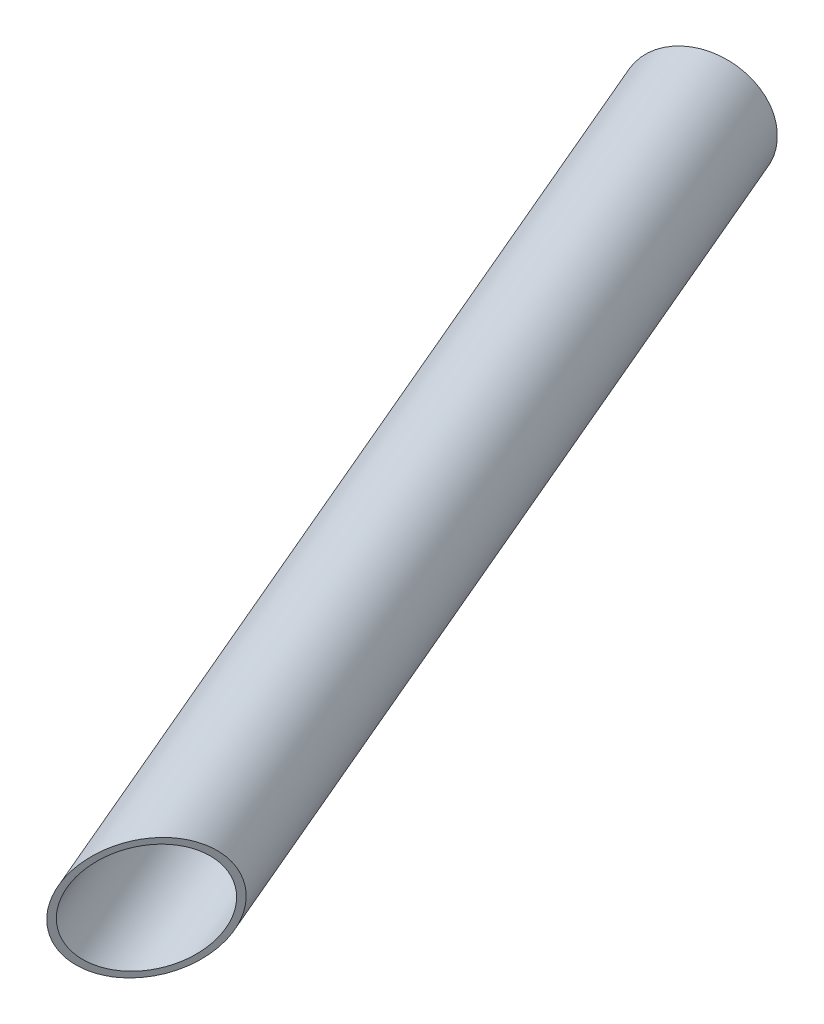
ISO-10303-21;
HEADER;
FILE_DESCRIPTION(('STEP AP214'),'2;1');
FILE_NAME('part.step','',(''),(''),'','','');
FILE_SCHEMA(('AUTOMOTIVE_DESIGN { 1 0 10303 214 1 1 1 1 }'));
ENDSEC;
DATA;
#1=APPLICATION_CONTEXT('core data for automotive mechanical design processes');
#2=APPLICATION_PROTOCOL_DEFINITION('international standard','automotive_design',2000,#1);
#3=PRODUCT_CONTEXT('',#1,'mechanical');
#4=PRODUCT('Part','Part','',(#3));
#5=PRODUCT_RELATED_PRODUCT_CATEGORY('part','',(#4));
#6=PRODUCT_DEFINITION_FORMATION('','',#4);
#7=PRODUCT_DEFINITION_CONTEXT('part definition',#1,'design');
#8=PRODUCT_DEFINITION('design','',#6,#7);
#9=PRODUCT_DEFINITION_SHAPE('','',#8);
#10=(LENGTH_UNIT() NAMED_UNIT(*) SI_UNIT(.MILLI.,.METRE.));
#11=(NAMED_UNIT(*) PLANE_ANGLE_UNIT() SI_UNIT($,.RADIAN.));
#12=(NAMED_UNIT(*) SI_UNIT($,.STERADIAN.) SOLID_ANGLE_UNIT());
#13=UNCERTAINTY_MEASURE_WITH_UNIT(LENGTH_MEASURE(1.E-05),#10,'distance_accuracy_value','');
#14=(GEOMETRIC_REPRESENTATION_CONTEXT(3) GLOBAL_UNCERTAINTY_ASSIGNED_CONTEXT((#13)) GLOBAL_UNIT_ASSIGNED_CONTEXT((#10,
#11,#12)) REPRESENTATION_CONTEXT('',''));
#15=CARTESIAN_POINT('',(0.,0.,0.));
#16=DIRECTION('',(0.,0.,1.));
#17=DIRECTION('',(1.,0.,0.));
#18=AXIS2_PLACEMENT_3D('',#15,#16,#17);
#19=CARTESIAN_POINT('',(-150.,0.,-200.));
#20=DIRECTION('',(0.391140640344852,0.,0.920330918458474));
#21=DIRECTION('',(0.920330918458475,0.,-0.391140640344852));
#22=AXIS2_PLACEMENT_3D('',#19,#20,#21);
#23=CYLINDRICAL_SURFACE('',#22,11.3);
#24=CARTESIAN_POINT('',(-150.,0.,-200.));
#25=DIRECTION('',(-0.391140640344852,0.,-0.920330918458475));
#26=DIRECTION('',(-0.920330918458475,0.,0.391140640344852));
#27=AXIS2_PLACEMENT_3D('',#24,#25,#26);
#28=CIRCLE('',#27,11.3);
#29=CARTESIAN_POINT('',(-160.399739378581,0.,-195.580110764103));
#30=VERTEX_POINT('',#29);
#31=EDGE_CURVE('E53',#30,#30,#28,.T.);
#32=ORIENTED_EDGE('',*,*,#31,.T.);
#33=EDGE_LOOP('',(#32));
#34=FACE_BOUND('',#33,.T.);
#35=CARTESIAN_POINT('',(-65.,0.,0.));
#36=DIRECTION('',(0.834008585191079,0.,0.551751465632466));
#37=DIRECTION('',(-0.551751465632466,0.,0.83400858519108));
#38=AXIS2_PLACEMENT_3D('',#35,#36,#37);
#39=ELLIPSE('',#38,13.5490211979186,11.3);
#40=CARTESIAN_POINT('',(-72.4756923038369,0.,11.3));
#41=VERTEX_POINT('',#40);
#42=EDGE_CURVE('E43',#41,#41,#39,.T.);
#43=ORIENTED_EDGE('',*,*,#42,.T.);
#44=EDGE_LOOP('',(#43));
#45=FACE_BOUND('',#44,.T.);
#46=ADVANCED_FACE('F39',(#34,#45),#23,.F.);
#47=CARTESIAN_POINT('',(-150.,0.,-200.));
#48=DIRECTION('',(0.391140640344852,0.,0.920330918458474));
#49=DIRECTION('',(0.920330918458475,0.,-0.391140640344852));
#50=AXIS2_PLACEMENT_3D('',#47,#48,#49);
#51=CYLINDRICAL_SURFACE('',#50,12.5);
#52=CARTESIAN_POINT('',(-150.,0.,-200.));
#53=DIRECTION('',(-0.391140640344852,0.,-0.920330918458475));
#54=DIRECTION('',(-0.920330918458475,0.,0.391140640344852));
#55=AXIS2_PLACEMENT_3D('',#52,#53,#54);
#56=CIRCLE('',#55,12.5);
#57=CARTESIAN_POINT('',(-161.504136480731,0.,-195.110741995689));
#58=VERTEX_POINT('',#57);
#59=EDGE_CURVE('E47',#58,#58,#56,.T.);
#60=ORIENTED_EDGE('',*,*,#59,.F.);
#61=EDGE_LOOP('',(#60));
#62=FACE_BOUND('',#61,.T.);
#63=CARTESIAN_POINT('',(-65.,0.,0.));
#64=DIRECTION('',(0.834008585191079,0.,0.551751465632466));
#65=DIRECTION('',(-0.551751465632466,0.,0.83400858519108));
#66=AXIS2_PLACEMENT_3D('',#63,#64,#65);
#67=ELLIPSE('',#66,14.987855307432,12.5);
#68=CARTESIAN_POINT('',(-73.269571132563,0.,12.5));
#69=VERTEX_POINT('',#68);
#70=EDGE_CURVE('E10',#69,#69,#67,.T.);
#71=ORIENTED_EDGE('',*,*,#70,.F.);
#72=EDGE_LOOP('',(#71));
#73=FACE_BOUND('',#72,.T.);
#74=ADVANCED_FACE('F66',(#62,#73),#51,.T.);
#75=CARTESIAN_POINT('',(-150.,0.,-200.));
#76=DIRECTION('',(-0.391140640344852,0.,-0.920330918458475));
#77=DIRECTION('',(-0.920330918458475,0.,0.391140640344852));
#78=AXIS2_PLACEMENT_3D('',#75,#76,#77);
#79=PLANE('',#78);
#80=ORIENTED_EDGE('',*,*,#31,.F.);
#81=EDGE_LOOP('',(#80));
#82=FACE_BOUND('',#81,.T.);
#83=ORIENTED_EDGE('',*,*,#59,.T.);
#84=EDGE_LOOP('',(#83));
#85=FACE_BOUND('',#84,.T.);
#86=ADVANCED_FACE('F62',(#82,#85),#79,.T.);
#87=CARTESIAN_POINT('',(-65.,0.,0.));
#88=DIRECTION('',(0.834008585191079,0.,0.551751465632466));
#89=DIRECTION('',(0.551751465632466,0.,-0.83400858519108));
#90=AXIS2_PLACEMENT_3D('',#87,#88,#89);
#91=PLANE('',#90);
#92=ORIENTED_EDGE('',*,*,#42,.F.);
#93=EDGE_LOOP('',(#92));
#94=FACE_BOUND('',#93,.T.);
#95=ORIENTED_EDGE('',*,*,#70,.T.);
#96=EDGE_LOOP('',(#95));
#97=FACE_BOUND('',#96,.T.);
#98=ADVANCED_FACE('F41',(#94,#97),#91,.T.);
#99=CLOSED_SHELL('',(#46,#74,#86,#98));
#100=MANIFOLD_SOLID_BREP('B2',#99);
#101=ADVANCED_BREP_SHAPE_REPRESENTATION('',(#18,#100),#14);
#102=SHAPE_DEFINITION_REPRESENTATION(#9,#101);
ENDSEC;
END-ISO-10303-21;
